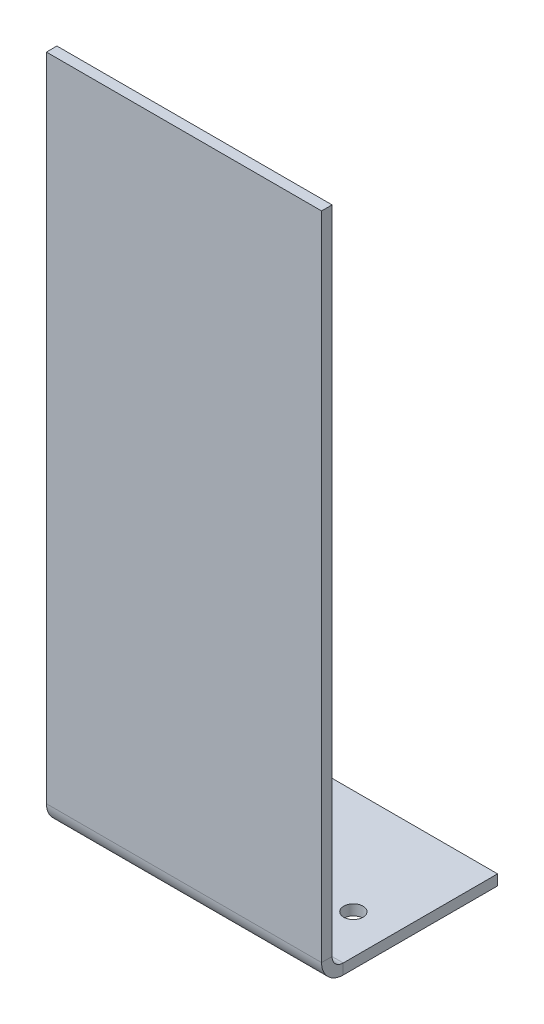
ISO-10303-21;
HEADER;
FILE_DESCRIPTION(('STEP AP214'),'2;1');
FILE_NAME('part.step','',(''),(''),'','','');
FILE_SCHEMA(('AUTOMOTIVE_DESIGN { 1 0 10303 214 1 1 1 1 }'));
ENDSEC;
DATA;
#1=APPLICATION_CONTEXT('core data for automotive mechanical design processes');
#2=APPLICATION_PROTOCOL_DEFINITION('international standard','automotive_design',2000,#1);
#3=PRODUCT_CONTEXT('',#1,'mechanical');
#4=PRODUCT('Part','Part','',(#3));
#5=PRODUCT_RELATED_PRODUCT_CATEGORY('part','',(#4));
#6=PRODUCT_DEFINITION_FORMATION('','',#4);
#7=PRODUCT_DEFINITION_CONTEXT('part definition',#1,'design');
#8=PRODUCT_DEFINITION('design','',#6,#7);
#9=PRODUCT_DEFINITION_SHAPE('','',#8);
#10=(LENGTH_UNIT() NAMED_UNIT(*) SI_UNIT(.MILLI.,.METRE.));
#11=(NAMED_UNIT(*) PLANE_ANGLE_UNIT() SI_UNIT($,.RADIAN.));
#12=(NAMED_UNIT(*) SI_UNIT($,.STERADIAN.) SOLID_ANGLE_UNIT());
#13=UNCERTAINTY_MEASURE_WITH_UNIT(LENGTH_MEASURE(1.E-05),#10,'distance_accuracy_value','');
#14=(GEOMETRIC_REPRESENTATION_CONTEXT(3) GLOBAL_UNCERTAINTY_ASSIGNED_CONTEXT((#13)) GLOBAL_UNIT_ASSIGNED_CONTEXT((#10,
#11,#12)) REPRESENTATION_CONTEXT('',''));
#15=CARTESIAN_POINT('',(0.,0.,0.));
#16=DIRECTION('',(0.,0.,1.));
#17=DIRECTION('',(1.,0.,0.));
#18=AXIS2_PLACEMENT_3D('',#15,#16,#17);
#19=CARTESIAN_POINT('',(0.,-25.5378945342031,26.862305465797));
#20=DIRECTION('',(-1.,0.,0.));
#21=DIRECTION('',(0.,1.,0.));
#22=AXIS2_PLACEMENT_3D('',#19,#20,#21);
#23=PLANE('',#22);
#24=DIRECTION('',(0.,1.,0.));
#25=VECTOR('',#24,1.);
#26=CARTESIAN_POINT('',(0.,-25.5378945342031,25.262105465797));
#27=LINE('',#26,#25);
#28=CARTESIAN_POINT('',(0.,1.7,25.2621054657969));
#29=VERTEX_POINT('',#28);
#30=CARTESIAN_POINT('',(0.,101.062105465797,25.2621054657966));
#31=VERTEX_POINT('',#30);
#32=EDGE_CURVE('E73',#29,#31,#27,.T.);
#33=ORIENTED_EDGE('',*,*,#32,.F.);
#34=DIRECTION('',(0.,0.,1.));
#35=VECTOR('',#34,1.);
#36=CARTESIAN_POINT('',(0.,1.70000000000001,26.8623054657969));
#37=LINE('',#36,#35);
#38=CARTESIAN_POINT('',(0.,1.70000000000001,26.8623054657969));
#39=VERTEX_POINT('',#38);
#40=EDGE_CURVE('E114',#29,#39,#37,.T.);
#41=ORIENTED_EDGE('',*,*,#40,.T.);
#42=DIRECTION('',(0.,1.,0.));
#43=VECTOR('',#42,1.);
#44=CARTESIAN_POINT('',(0.,-25.5378945342031,26.862305465797));
#45=LINE('',#44,#43);
#46=CARTESIAN_POINT('',(0.,101.062105465797,26.8623054657965));
#47=VERTEX_POINT('',#46);
#48=EDGE_CURVE('E52',#39,#47,#45,.T.);
#49=ORIENTED_EDGE('',*,*,#48,.T.);
#50=DIRECTION('',(0.,0.,-1.));
#51=VECTOR('',#50,1.);
#52=CARTESIAN_POINT('',(0.,101.062105465797,26.8623054657965));
#53=LINE('',#52,#51);
#54=EDGE_CURVE('E225',#47,#31,#53,.T.);
#55=ORIENTED_EDGE('',*,*,#54,.T.);
#56=EDGE_LOOP('',(#33,#41,#49,#55));
#57=FACE_BOUND('',#56,.T.);
#58=ADVANCED_FACE('F48',(#57),#23,.T.);
#59=CARTESIAN_POINT('',(42.,-25.5378945342031,26.862305465797));
#60=DIRECTION('',(1.,0.,0.));
#61=DIRECTION('',(0.,-1.,0.));
#62=AXIS2_PLACEMENT_3D('',#59,#60,#61);
#63=PLANE('',#62);
#64=DIRECTION('',(0.,-1.,0.));
#65=VECTOR('',#64,1.);
#66=CARTESIAN_POINT('',(42.,-25.5378945342031,26.862305465797));
#67=LINE('',#66,#65);
#68=CARTESIAN_POINT('',(42.,101.062105465797,26.8623054657966));
#69=VERTEX_POINT('',#68);
#70=CARTESIAN_POINT('',(42.,1.7,26.8623054657969));
#71=VERTEX_POINT('',#70);
#72=EDGE_CURVE('E219',#69,#71,#67,.T.);
#73=ORIENTED_EDGE('',*,*,#72,.T.);
#74=DIRECTION('',(0.,0.,-1.));
#75=VECTOR('',#74,1.);
#76=CARTESIAN_POINT('',(42.,1.70000000000001,26.8623054657969));
#77=LINE('',#76,#75);
#78=CARTESIAN_POINT('',(42.,1.7,25.2621054657969));
#79=VERTEX_POINT('',#78);
#80=EDGE_CURVE('E12',#71,#79,#77,.T.);
#81=ORIENTED_EDGE('',*,*,#80,.T.);
#82=DIRECTION('',(0.,-1.,0.));
#83=VECTOR('',#82,1.);
#84=CARTESIAN_POINT('',(42.,-25.5378945342031,25.262105465797));
#85=LINE('',#84,#83);
#86=CARTESIAN_POINT('',(42.,101.062105465797,25.2621054657966));
#87=VERTEX_POINT('',#86);
#88=EDGE_CURVE('E66',#87,#79,#85,.T.);
#89=ORIENTED_EDGE('',*,*,#88,.F.);
#90=DIRECTION('',(0.,0.,-1.));
#91=VECTOR('',#90,1.);
#92=CARTESIAN_POINT('',(42.,101.062105465797,26.8623054657966));
#93=LINE('',#92,#91);
#94=EDGE_CURVE('E142',#69,#87,#93,.T.);
#95=ORIENTED_EDGE('',*,*,#94,.F.);
#96=EDGE_LOOP('',(#73,#81,#89,#95));
#97=FACE_BOUND('',#96,.T.);
#98=ADVANCED_FACE('F50',(#97),#63,.T.);
#99=CARTESIAN_POINT('',(0.,-25.5378945342031,25.262105465797));
#100=DIRECTION('',(0.,0.,-1.));
#101=DIRECTION('',(0.,1.,0.));
#102=AXIS2_PLACEMENT_3D('',#99,#100,#101);
#103=PLANE('',#102);
#104=ORIENTED_EDGE('',*,*,#88,.T.);
#105=DIRECTION('',(-1.,0.,0.));
#106=VECTOR('',#105,1.);
#107=CARTESIAN_POINT('',(0.,1.7,25.2621054657969));
#108=LINE('',#107,#106);
#109=EDGE_CURVE('E58',#79,#29,#108,.T.);
#110=ORIENTED_EDGE('',*,*,#109,.T.);
#111=ORIENTED_EDGE('',*,*,#32,.T.);
#112=DIRECTION('',(1.,0.,0.));
#113=VECTOR('',#112,1.);
#114=CARTESIAN_POINT('',(0.,101.062105465797,25.2621054657966));
#115=LINE('',#114,#113);
#116=EDGE_CURVE('E220',#31,#87,#115,.T.);
#117=ORIENTED_EDGE('',*,*,#116,.T.);
#118=EDGE_LOOP('',(#104,#110,#111,#117));
#119=FACE_BOUND('',#118,.T.);
#120=ADVANCED_FACE('F234',(#119),#103,.T.);
#121=CARTESIAN_POINT('',(0.,101.062105465797,26.8623054657965));
#122=DIRECTION('',(0.,1.,0.));
#123=DIRECTION('',(1.,0.,0.));
#124=AXIS2_PLACEMENT_3D('',#121,#122,#123);
#125=PLANE('',#124);
#126=ORIENTED_EDGE('',*,*,#116,.F.);
#127=ORIENTED_EDGE('',*,*,#54,.F.);
#128=DIRECTION('',(1.,0.,0.));
#129=VECTOR('',#128,1.);
#130=CARTESIAN_POINT('',(0.,101.062105465797,26.8623054657965));
#131=LINE('',#130,#129);
#132=EDGE_CURVE('E131',#47,#69,#131,.T.);
#133=ORIENTED_EDGE('',*,*,#132,.T.);
#134=ORIENTED_EDGE('',*,*,#94,.T.);
#135=EDGE_LOOP('',(#126,#127,#133,#134));
#136=FACE_BOUND('',#135,.T.);
#137=ADVANCED_FACE('F238',(#136),#125,.T.);
#138=CARTESIAN_POINT('',(0.,-25.5378945342031,26.862305465797));
#139=DIRECTION('',(0.,0.,-1.));
#140=DIRECTION('',(0.,1.,0.));
#141=AXIS2_PLACEMENT_3D('',#138,#139,#140);
#142=PLANE('',#141);
#143=DIRECTION('',(-1.,0.,0.));
#144=VECTOR('',#143,1.);
#145=CARTESIAN_POINT('',(0.,1.70000000000001,26.8623054657969));
#146=LINE('',#145,#144);
#147=EDGE_CURVE('E122',#71,#39,#146,.T.);
#148=ORIENTED_EDGE('',*,*,#147,.F.);
#149=ORIENTED_EDGE('',*,*,#72,.F.);
#150=ORIENTED_EDGE('',*,*,#132,.F.);
#151=ORIENTED_EDGE('',*,*,#48,.F.);
#152=EDGE_LOOP('',(#148,#149,#150,#151));
#153=FACE_BOUND('',#152,.T.);
#154=ADVANCED_FACE('F127',(#153),#142,.F.);
#155=CARTESIAN_POINT('',(0.,-1.6002,0.));
#156=DIRECTION('',(0.,0.,-1.));
#157=DIRECTION('',(-1.,0.,0.));
#158=AXIS2_PLACEMENT_3D('',#155,#156,#157);
#159=PLANE('',#158);
#160=DIRECTION('',(-1.,0.,0.));
#161=VECTOR('',#160,1.);
#162=CARTESIAN_POINT('',(0.,0.,0.));
#163=LINE('',#162,#161);
#164=CARTESIAN_POINT('',(42.,0.,0.));
#165=VERTEX_POINT('',#164);
#166=CARTESIAN_POINT('',(0.,0.,0.));
#167=VERTEX_POINT('',#166);
#168=EDGE_CURVE('E175',#165,#167,#163,.T.);
#169=ORIENTED_EDGE('',*,*,#168,.F.);
#170=DIRECTION('',(0.,1.,0.));
#171=VECTOR('',#170,1.);
#172=CARTESIAN_POINT('',(42.,-1.6002,0.));
#173=LINE('',#172,#171);
#174=CARTESIAN_POINT('',(42.,-1.6002,0.));
#175=VERTEX_POINT('',#174);
#176=EDGE_CURVE('E165',#175,#165,#173,.T.);
#177=ORIENTED_EDGE('',*,*,#176,.F.);
#178=DIRECTION('',(-1.,0.,0.));
#179=VECTOR('',#178,1.);
#180=CARTESIAN_POINT('',(0.,-1.6002,0.));
#181=LINE('',#180,#179);
#182=CARTESIAN_POINT('',(0.,-1.6002,0.));
#183=VERTEX_POINT('',#182);
#184=EDGE_CURVE('E208',#175,#183,#181,.T.);
#185=ORIENTED_EDGE('',*,*,#184,.T.);
#186=DIRECTION('',(0.,1.,0.));
#187=VECTOR('',#186,1.);
#188=CARTESIAN_POINT('',(0.,-1.6002,0.));
#189=LINE('',#188,#187);
#190=EDGE_CURVE('E205',#183,#167,#189,.T.);
#191=ORIENTED_EDGE('',*,*,#190,.T.);
#192=EDGE_LOOP('',(#169,#177,#185,#191));
#193=FACE_BOUND('',#192,.T.);
#194=ADVANCED_FACE('F263',(#193),#159,.T.);
#195=CARTESIAN_POINT('',(6.,-1.6002,16.01));
#196=DIRECTION('',(0.,1.,0.));
#197=DIRECTION('',(0.,0.,1.));
#198=AXIS2_PLACEMENT_3D('',#195,#196,#197);
#199=CYLINDRICAL_SURFACE('',#198,1.4732);
#200=CARTESIAN_POINT('',(6.,-1.6002,16.01));
#201=DIRECTION('',(0.,1.,0.));
#202=DIRECTION('',(0.,0.,1.));
#203=AXIS2_PLACEMENT_3D('',#200,#201,#202);
#204=CIRCLE('',#203,1.4732);
#205=CARTESIAN_POINT('',(6.,-1.6002,17.4832));
#206=VERTEX_POINT('',#205);
#207=EDGE_CURVE('E189',#206,#206,#204,.T.);
#208=ORIENTED_EDGE('',*,*,#207,.F.);
#209=EDGE_LOOP('',(#208));
#210=FACE_BOUND('',#209,.T.);
#211=CARTESIAN_POINT('',(6.,0.,16.01));
#212=DIRECTION('',(0.,1.,0.));
#213=DIRECTION('',(0.,0.,1.));
#214=AXIS2_PLACEMENT_3D('',#211,#212,#213);
#215=CIRCLE('',#214,1.4732);
#216=CARTESIAN_POINT('',(6.,0.,17.4832));
#217=VERTEX_POINT('',#216);
#218=EDGE_CURVE('E201',#217,#217,#215,.T.);
#219=ORIENTED_EDGE('',*,*,#218,.T.);
#220=EDGE_LOOP('',(#219));
#221=FACE_BOUND('',#220,.T.);
#222=ADVANCED_FACE('F265',(#210,#221),#199,.F.);
#223=CARTESIAN_POINT('',(36.,-1.6002,16.01));
#224=DIRECTION('',(0.,1.,0.));
#225=DIRECTION('',(0.,0.,1.));
#226=AXIS2_PLACEMENT_3D('',#223,#224,#225);
#227=CYLINDRICAL_SURFACE('',#226,1.4732);
#228=CARTESIAN_POINT('',(36.,-1.6002,16.01));
#229=DIRECTION('',(0.,1.,0.));
#230=DIRECTION('',(0.,0.,1.));
#231=AXIS2_PLACEMENT_3D('',#228,#229,#230);
#232=CIRCLE('',#231,1.4732);
#233=CARTESIAN_POINT('',(36.,-1.6002,17.4832));
#234=VERTEX_POINT('',#233);
#235=EDGE_CURVE('E193',#234,#234,#232,.T.);
#236=ORIENTED_EDGE('',*,*,#235,.F.);
#237=EDGE_LOOP('',(#236));
#238=FACE_BOUND('',#237,.T.);
#239=CARTESIAN_POINT('',(36.,0.,16.01));
#240=DIRECTION('',(0.,1.,0.));
#241=DIRECTION('',(0.,0.,1.));
#242=AXIS2_PLACEMENT_3D('',#239,#240,#241);
#243=CIRCLE('',#242,1.4732);
#244=CARTESIAN_POINT('',(36.,0.,17.4832));
#245=VERTEX_POINT('',#244);
#246=EDGE_CURVE('E197',#245,#245,#243,.T.);
#247=ORIENTED_EDGE('',*,*,#246,.T.);
#248=EDGE_LOOP('',(#247));
#249=FACE_BOUND('',#248,.T.);
#250=ADVANCED_FACE('F271',(#238,#249),#227,.F.);
#251=CARTESIAN_POINT('',(0.,-1.6002,0.));
#252=DIRECTION('',(0.,1.,0.));
#253=DIRECTION('',(0.,0.,1.));
#254=AXIS2_PLACEMENT_3D('',#251,#252,#253);
#255=PLANE('',#254);
#256=ORIENTED_EDGE('',*,*,#235,.T.);
#257=EDGE_LOOP('',(#256));
#258=FACE_BOUND('',#257,.T.);
#259=ORIENTED_EDGE('',*,*,#207,.T.);
#260=EDGE_LOOP('',(#259));
#261=FACE_BOUND('',#260,.T.);
#262=DIRECTION('',(0.,0.,-1.));
#263=VECTOR('',#262,1.);
#264=CARTESIAN_POINT('',(42.,-1.6002,0.));
#265=LINE('',#264,#263);
#266=CARTESIAN_POINT('',(42.,-1.6002,23.5621054657969));
#267=VERTEX_POINT('',#266);
#268=EDGE_CURVE('E169',#267,#175,#265,.T.);
#269=ORIENTED_EDGE('',*,*,#268,.F.);
#270=DIRECTION('',(-1.,0.,0.));
#271=VECTOR('',#270,1.);
#272=CARTESIAN_POINT('',(0.,-1.6002,23.5621054657969));
#273=LINE('',#272,#271);
#274=CARTESIAN_POINT('',(0.,-1.6002,23.5621054657969));
#275=VERTEX_POINT('',#274);
#276=EDGE_CURVE('E185',#267,#275,#273,.T.);
#277=ORIENTED_EDGE('',*,*,#276,.T.);
#278=DIRECTION('',(0.,0.,1.));
#279=VECTOR('',#278,1.);
#280=CARTESIAN_POINT('',(0.,-1.6002,0.));
#281=LINE('',#280,#279);
#282=EDGE_CURVE('E182',#183,#275,#281,.T.);
#283=ORIENTED_EDGE('',*,*,#282,.F.);
#284=ORIENTED_EDGE('',*,*,#184,.F.);
#285=EDGE_LOOP('',(#269,#277,#283,#284));
#286=FACE_BOUND('',#285,.T.);
#287=ADVANCED_FACE('F261',(#258,#261,#286),#255,.F.);
#288=CARTESIAN_POINT('',(0.,-1.6002,0.));
#289=DIRECTION('',(-1.,0.,0.));
#290=DIRECTION('',(0.,0.,1.));
#291=AXIS2_PLACEMENT_3D('',#288,#289,#290);
#292=PLANE('',#291);
#293=DIRECTION('',(0.,-1.,0.));
#294=VECTOR('',#293,1.);
#295=CARTESIAN_POINT('',(0.,-1.6002,23.5621054657969));
#296=LINE('',#295,#294);
#297=CARTESIAN_POINT('',(0.,0.,23.5621054657969));
#298=VERTEX_POINT('',#297);
#299=EDGE_CURVE('E147',#298,#275,#296,.T.);
#300=ORIENTED_EDGE('',*,*,#299,.F.);
#301=DIRECTION('',(0.,0.,1.));
#302=VECTOR('',#301,1.);
#303=CARTESIAN_POINT('',(0.,0.,0.));
#304=LINE('',#303,#302);
#305=EDGE_CURVE('E172',#167,#298,#304,.T.);
#306=ORIENTED_EDGE('',*,*,#305,.F.);
#307=ORIENTED_EDGE('',*,*,#190,.F.);
#308=ORIENTED_EDGE('',*,*,#282,.T.);
#309=EDGE_LOOP('',(#300,#306,#307,#308));
#310=FACE_BOUND('',#309,.T.);
#311=ADVANCED_FACE('F257',(#310),#292,.T.);
#312=CARTESIAN_POINT('',(0.,0.,0.));
#313=DIRECTION('',(0.,1.,0.));
#314=DIRECTION('',(0.,0.,1.));
#315=AXIS2_PLACEMENT_3D('',#312,#313,#314);
#316=PLANE('',#315);
#317=DIRECTION('',(-1.,0.,0.));
#318=VECTOR('',#317,1.);
#319=CARTESIAN_POINT('',(0.,0.,23.5621054657969));
#320=LINE('',#319,#318);
#321=CARTESIAN_POINT('',(42.,0.,23.5621054657969));
#322=VERTEX_POINT('',#321);
#323=EDGE_CURVE('E154',#322,#298,#320,.T.);
#324=ORIENTED_EDGE('',*,*,#323,.F.);
#325=DIRECTION('',(0.,0.,-1.));
#326=VECTOR('',#325,1.);
#327=CARTESIAN_POINT('',(42.,0.,0.));
#328=LINE('',#327,#326);
#329=EDGE_CURVE('E179',#322,#165,#328,.T.);
#330=ORIENTED_EDGE('',*,*,#329,.T.);
#331=ORIENTED_EDGE('',*,*,#168,.T.);
#332=ORIENTED_EDGE('',*,*,#305,.T.);
#333=EDGE_LOOP('',(#324,#330,#331,#332));
#334=FACE_BOUND('',#333,.T.);
#335=ORIENTED_EDGE('',*,*,#246,.F.);
#336=EDGE_LOOP('',(#335));
#337=FACE_BOUND('',#336,.T.);
#338=ORIENTED_EDGE('',*,*,#218,.F.);
#339=EDGE_LOOP('',(#338));
#340=FACE_BOUND('',#339,.T.);
#341=ADVANCED_FACE('F253',(#334,#337,#340),#316,.T.);
#342=CARTESIAN_POINT('',(42.,-1.6002,0.));
#343=DIRECTION('',(1.,0.,0.));
#344=DIRECTION('',(0.,0.,-1.));
#345=AXIS2_PLACEMENT_3D('',#342,#343,#344);
#346=PLANE('',#345);
#347=DIRECTION('',(0.,1.,0.));
#348=VECTOR('',#347,1.);
#349=CARTESIAN_POINT('',(42.,-1.6002,23.5621054657969));
#350=LINE('',#349,#348);
#351=EDGE_CURVE('E149',#267,#322,#350,.T.);
#352=ORIENTED_EDGE('',*,*,#351,.F.);
#353=ORIENTED_EDGE('',*,*,#268,.T.);
#354=ORIENTED_EDGE('',*,*,#176,.T.);
#355=ORIENTED_EDGE('',*,*,#329,.F.);
#356=EDGE_LOOP('',(#352,#353,#354,#355));
#357=FACE_BOUND('',#356,.T.);
#358=ADVANCED_FACE('F248',(#357),#346,.T.);
#359=CARTESIAN_POINT('',(42.,1.7,23.5621054657969));
#360=DIRECTION('',(1.,0.,0.));
#361=DIRECTION('',(0.,0.,-1.));
#362=AXIS2_PLACEMENT_3D('',#359,#360,#361);
#363=PLANE('',#362);
#364=ORIENTED_EDGE('',*,*,#351,.T.);
#365=CARTESIAN_POINT('',(42.,1.7,23.5621054657969));
#366=DIRECTION('',(-1.,0.,0.));
#367=DIRECTION('',(0.,0.,1.));
#368=AXIS2_PLACEMENT_3D('',#365,#366,#367);
#369=CIRCLE('',#368,1.7);
#370=EDGE_CURVE('E161',#322,#79,#369,.T.);
#371=ORIENTED_EDGE('',*,*,#370,.T.);
#372=ORIENTED_EDGE('',*,*,#80,.F.);
#373=CARTESIAN_POINT('',(42.,1.7,23.5621054657969));
#374=DIRECTION('',(-1.,0.,0.));
#375=DIRECTION('',(0.,0.,-1.));
#376=AXIS2_PLACEMENT_3D('',#373,#374,#375);
#377=CIRCLE('',#376,3.3002);
#378=EDGE_CURVE('E140',#267,#71,#377,.T.);
#379=ORIENTED_EDGE('',*,*,#378,.F.);
#380=EDGE_LOOP('',(#364,#371,#372,#379));
#381=FACE_BOUND('',#380,.T.);
#382=ADVANCED_FACE('F245',(#381),#363,.T.);
#383=CARTESIAN_POINT('',(0.,1.7,23.5621054657969));
#384=DIRECTION('',(-1.,0.,0.));
#385=DIRECTION('',(0.,0.,1.));
#386=AXIS2_PLACEMENT_3D('',#383,#384,#385);
#387=PLANE('',#386);
#388=ORIENTED_EDGE('',*,*,#40,.F.);
#389=CARTESIAN_POINT('',(0.,1.7,23.5621054657969));
#390=DIRECTION('',(-1.,0.,0.));
#391=DIRECTION('',(0.,0.,1.));
#392=AXIS2_PLACEMENT_3D('',#389,#390,#391);
#393=CIRCLE('',#392,1.7);
#394=EDGE_CURVE('E156',#29,#298,#393,.F.);
#395=ORIENTED_EDGE('',*,*,#394,.T.);
#396=ORIENTED_EDGE('',*,*,#299,.T.);
#397=CARTESIAN_POINT('',(0.,1.7,23.5621054657969));
#398=DIRECTION('',(1.,0.,0.));
#399=DIRECTION('',(0.,0.,1.));
#400=AXIS2_PLACEMENT_3D('',#397,#398,#399);
#401=CIRCLE('',#400,3.3002);
#402=EDGE_CURVE('E138',#39,#275,#401,.T.);
#403=ORIENTED_EDGE('',*,*,#402,.F.);
#404=EDGE_LOOP('',(#388,#395,#396,#403));
#405=FACE_BOUND('',#404,.T.);
#406=ADVANCED_FACE('F145',(#405),#387,.T.);
#407=CARTESIAN_POINT('',(63.1909002667093,1.7,23.5621054657969));
#408=DIRECTION('',(-1.,0.,0.));
#409=DIRECTION('',(0.,0.,1.));
#410=AXIS2_PLACEMENT_3D('',#407,#408,#409);
#411=CYLINDRICAL_SURFACE('',#410,3.3002);
#412=ORIENTED_EDGE('',*,*,#402,.T.);
#413=ORIENTED_EDGE('',*,*,#276,.F.);
#414=ORIENTED_EDGE('',*,*,#378,.T.);
#415=ORIENTED_EDGE('',*,*,#147,.T.);
#416=EDGE_LOOP('',(#412,#413,#414,#415));
#417=FACE_BOUND('',#416,.T.);
#418=ADVANCED_FACE('F136',(#417),#411,.T.);
#419=CARTESIAN_POINT('',(63.1909002667093,1.7,23.5621054657969));
#420=DIRECTION('',(-1.,0.,0.));
#421=DIRECTION('',(0.,0.,1.));
#422=AXIS2_PLACEMENT_3D('',#419,#420,#421);
#423=CYLINDRICAL_SURFACE('',#422,1.7);
#424=ORIENTED_EDGE('',*,*,#394,.F.);
#425=ORIENTED_EDGE('',*,*,#109,.F.);
#426=ORIENTED_EDGE('',*,*,#370,.F.);
#427=ORIENTED_EDGE('',*,*,#323,.T.);
#428=EDGE_LOOP('',(#424,#425,#426,#427));
#429=FACE_BOUND('',#428,.T.);
#430=ADVANCED_FACE('F244',(#429),#423,.F.);
#431=CLOSED_SHELL('',(#58,#98,#120,#137,#154,#194,#222,#250,#287,#311,#341,#358,#382,#406,#418,#430));
#432=MANIFOLD_SOLID_BREP('B2',#431);
#433=ADVANCED_BREP_SHAPE_REPRESENTATION('',(#18,#432),#14);
#434=SHAPE_DEFINITION_REPRESENTATION(#9,#433);
ENDSEC;
END-ISO-10303-21;
